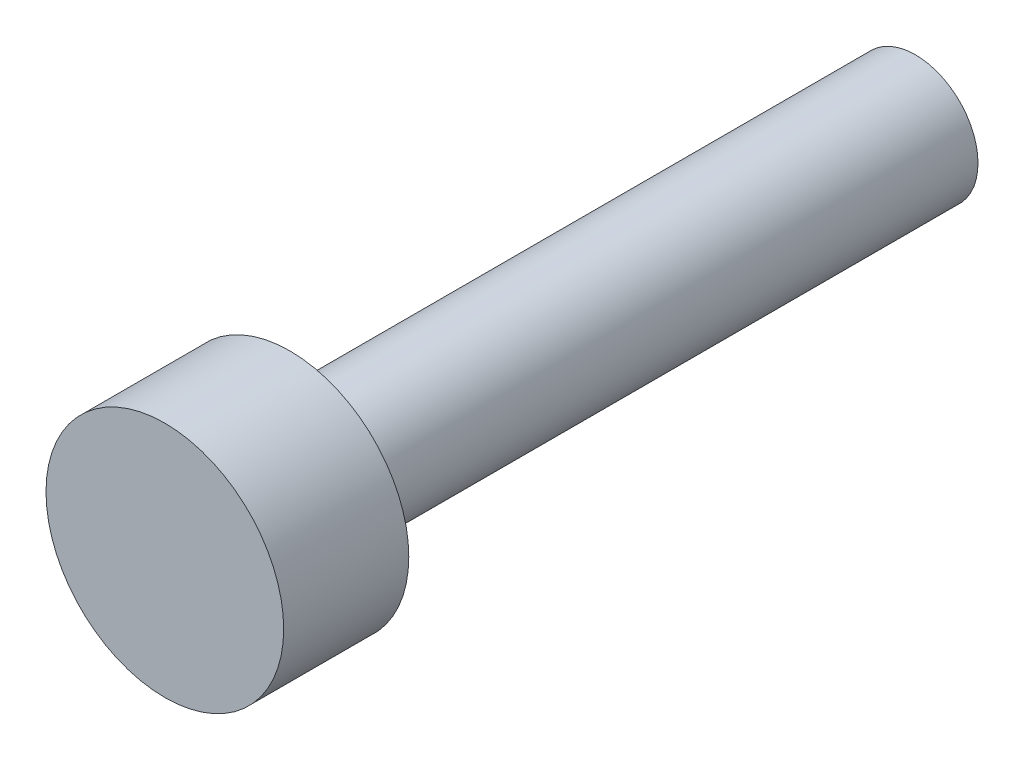
ISO-10303-21;
HEADER;
FILE_DESCRIPTION(('STEP AP214'),'2;1');
FILE_NAME('part.step','',(''),(''),'','','');
FILE_SCHEMA(('AUTOMOTIVE_DESIGN { 1 0 10303 214 1 1 1 1 }'));
ENDSEC;
DATA;
#1=APPLICATION_CONTEXT('core data for automotive mechanical design processes');
#2=APPLICATION_PROTOCOL_DEFINITION('international standard','automotive_design',2000,#1);
#3=PRODUCT_CONTEXT('',#1,'mechanical');
#4=PRODUCT('Part','Part','',(#3));
#5=PRODUCT_RELATED_PRODUCT_CATEGORY('part','',(#4));
#6=PRODUCT_DEFINITION_FORMATION('','',#4);
#7=PRODUCT_DEFINITION_CONTEXT('part definition',#1,'design');
#8=PRODUCT_DEFINITION('design','',#6,#7);
#9=PRODUCT_DEFINITION_SHAPE('','',#8);
#10=(LENGTH_UNIT() NAMED_UNIT(*) SI_UNIT(.MILLI.,.METRE.));
#11=(NAMED_UNIT(*) PLANE_ANGLE_UNIT() SI_UNIT($,.RADIAN.));
#12=(NAMED_UNIT(*) SI_UNIT($,.STERADIAN.) SOLID_ANGLE_UNIT());
#13=UNCERTAINTY_MEASURE_WITH_UNIT(LENGTH_MEASURE(1.E-05),#10,'distance_accuracy_value','');
#14=(GEOMETRIC_REPRESENTATION_CONTEXT(3) GLOBAL_UNCERTAINTY_ASSIGNED_CONTEXT((#13)) GLOBAL_UNIT_ASSIGNED_CONTEXT((#10,
#11,#12)) REPRESENTATION_CONTEXT('',''));
#15=CARTESIAN_POINT('',(0.,0.,0.));
#16=DIRECTION('',(0.,0.,1.));
#17=DIRECTION('',(1.,0.,0.));
#18=AXIS2_PLACEMENT_3D('',#15,#16,#17);
#19=CARTESIAN_POINT('',(0.,0.,0.));
#20=DIRECTION('',(0.,0.,-1.));
#21=DIRECTION('',(-1.,0.,0.));
#22=AXIS2_PLACEMENT_3D('',#19,#20,#21);
#23=CYLINDRICAL_SURFACE('',#22,1.);
#24=CARTESIAN_POINT('',(0.,0.,0.));
#25=DIRECTION('',(0.,0.,1.));
#26=DIRECTION('',(1.,0.,0.));
#27=AXIS2_PLACEMENT_3D('',#24,#25,#26);
#28=CIRCLE('',#27,1.);
#29=CARTESIAN_POINT('',(1.,0.,0.));
#30=VERTEX_POINT('',#29);
#31=EDGE_CURVE('E10',#30,#30,#28,.T.);
#32=ORIENTED_EDGE('',*,*,#31,.F.);
#33=EDGE_LOOP('',(#32));
#34=FACE_BOUND('',#33,.T.);
#35=CARTESIAN_POINT('',(0.,0.,-10.));
#36=DIRECTION('',(0.,0.,1.));
#37=DIRECTION('',(1.,0.,0.));
#38=AXIS2_PLACEMENT_3D('',#35,#36,#37);
#39=CIRCLE('',#38,1.);
#40=CARTESIAN_POINT('',(1.,0.,-10.));
#41=VERTEX_POINT('',#40);
#42=EDGE_CURVE('E45',#41,#41,#39,.T.);
#43=ORIENTED_EDGE('',*,*,#42,.T.);
#44=EDGE_LOOP('',(#43));
#45=FACE_BOUND('',#44,.T.);
#46=ADVANCED_FACE('F39',(#34,#45),#23,.T.);
#47=CARTESIAN_POINT('',(0.,0.,-10.));
#48=DIRECTION('',(0.,0.,1.));
#49=DIRECTION('',(1.,0.,0.));
#50=AXIS2_PLACEMENT_3D('',#47,#48,#49);
#51=PLANE('',#50);
#52=ORIENTED_EDGE('',*,*,#42,.F.);
#53=EDGE_LOOP('',(#52));
#54=FACE_BOUND('',#53,.T.);
#55=ADVANCED_FACE('F65',(#54),#51,.F.);
#56=CARTESIAN_POINT('',(0.,0.,2.));
#57=DIRECTION('',(0.,0.,-1.));
#58=DIRECTION('',(-1.,0.,0.));
#59=AXIS2_PLACEMENT_3D('',#56,#57,#58);
#60=CYLINDRICAL_SURFACE('',#59,1.9);
#61=CARTESIAN_POINT('',(0.,0.,2.));
#62=DIRECTION('',(0.,0.,1.));
#63=DIRECTION('',(1.,0.,0.));
#64=AXIS2_PLACEMENT_3D('',#61,#62,#63);
#65=CIRCLE('',#64,1.9);
#66=CARTESIAN_POINT('',(1.9,0.,2.));
#67=VERTEX_POINT('',#66);
#68=EDGE_CURVE('E47',#67,#67,#65,.T.);
#69=ORIENTED_EDGE('',*,*,#68,.F.);
#70=EDGE_LOOP('',(#69));
#71=FACE_BOUND('',#70,.T.);
#72=CARTESIAN_POINT('',(0.,0.,0.));
#73=DIRECTION('',(0.,0.,1.));
#74=DIRECTION('',(1.,0.,0.));
#75=AXIS2_PLACEMENT_3D('',#72,#73,#74);
#76=CIRCLE('',#75,1.9);
#77=CARTESIAN_POINT('',(1.9,0.,0.));
#78=VERTEX_POINT('',#77);
#79=EDGE_CURVE('E51',#78,#78,#76,.T.);
#80=ORIENTED_EDGE('',*,*,#79,.T.);
#81=EDGE_LOOP('',(#80));
#82=FACE_BOUND('',#81,.T.);
#83=ADVANCED_FACE('F56',(#71,#82),#60,.T.);
#84=CARTESIAN_POINT('',(0.,0.,2.));
#85=DIRECTION('',(0.,0.,1.));
#86=DIRECTION('',(1.,0.,0.));
#87=AXIS2_PLACEMENT_3D('',#84,#85,#86);
#88=PLANE('',#87);
#89=ORIENTED_EDGE('',*,*,#68,.T.);
#90=EDGE_LOOP('',(#89));
#91=FACE_BOUND('',#90,.T.);
#92=ADVANCED_FACE('F60',(#91),#88,.T.);
#93=CARTESIAN_POINT('',(0.,0.,0.));
#94=DIRECTION('',(0.,0.,1.));
#95=DIRECTION('',(1.,0.,0.));
#96=AXIS2_PLACEMENT_3D('',#93,#94,#95);
#97=PLANE('',#96);
#98=ORIENTED_EDGE('',*,*,#31,.T.);
#99=EDGE_LOOP('',(#98));
#100=FACE_BOUND('',#99,.T.);
#101=ORIENTED_EDGE('',*,*,#79,.F.);
#102=EDGE_LOOP('',(#101));
#103=FACE_BOUND('',#102,.T.);
#104=ADVANCED_FACE('F68',(#100,#103),#97,.F.);
#105=CLOSED_SHELL('',(#46,#55,#83,#92,#104));
#106=MANIFOLD_SOLID_BREP('B2',#105);
#107=ADVANCED_BREP_SHAPE_REPRESENTATION('',(#18,#106),#14);
#108=SHAPE_DEFINITION_REPRESENTATION(#9,#107);
ENDSEC;
END-ISO-10303-21;
